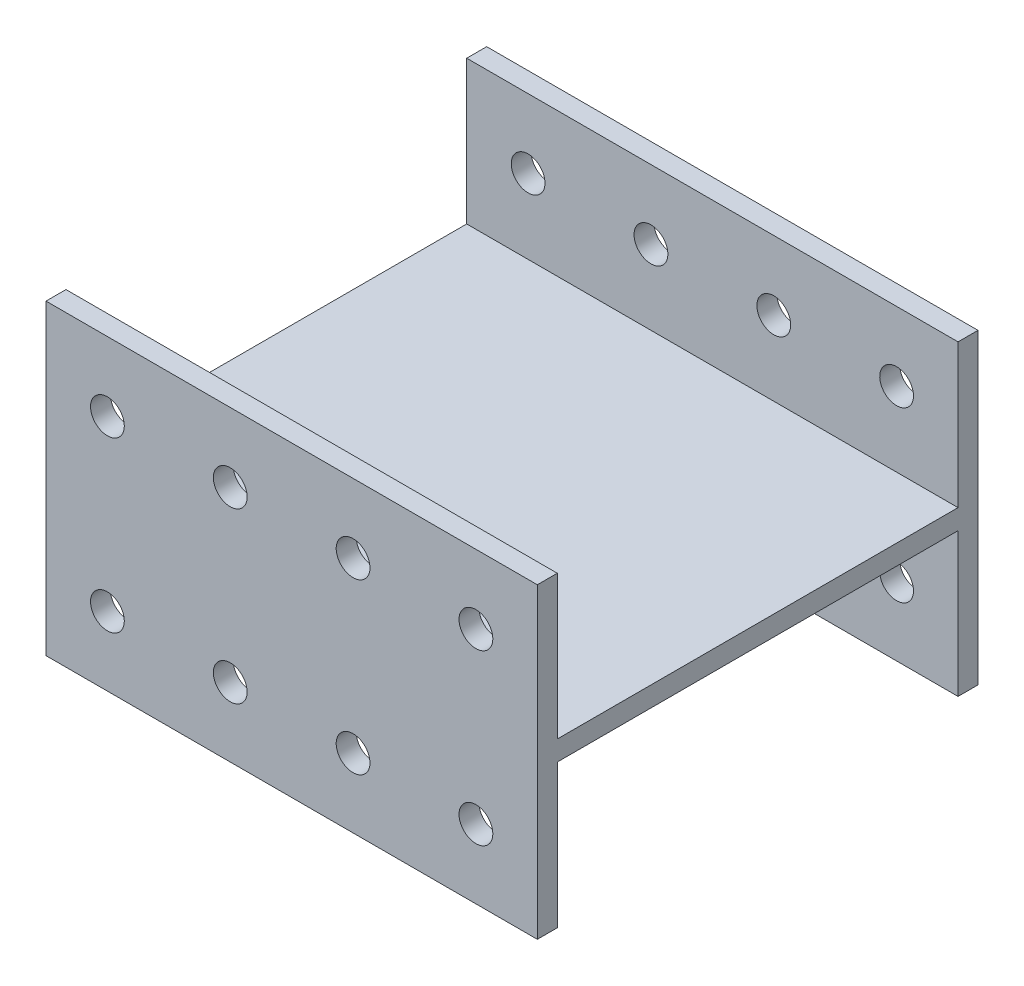
ISO-10303-21;
HEADER;
FILE_DESCRIPTION(('STEP AP214'),'2;1');
FILE_NAME('part.step','',(''),(''),'','','');
FILE_SCHEMA(('AUTOMOTIVE_DESIGN { 1 0 10303 214 1 1 1 1 }'));
ENDSEC;
DATA;
#1=APPLICATION_CONTEXT('core data for automotive mechanical design processes');
#2=APPLICATION_PROTOCOL_DEFINITION('international standard','automotive_design',2000,#1);
#3=PRODUCT_CONTEXT('',#1,'mechanical');
#4=PRODUCT('Part','Part','',(#3));
#5=PRODUCT_RELATED_PRODUCT_CATEGORY('part','',(#4));
#6=PRODUCT_DEFINITION_FORMATION('','',#4);
#7=PRODUCT_DEFINITION_CONTEXT('part definition',#1,'design');
#8=PRODUCT_DEFINITION('design','',#6,#7);
#9=PRODUCT_DEFINITION_SHAPE('','',#8);
#10=(LENGTH_UNIT() NAMED_UNIT(*) SI_UNIT(.MILLI.,.METRE.));
#11=(NAMED_UNIT(*) PLANE_ANGLE_UNIT() SI_UNIT($,.RADIAN.));
#12=(NAMED_UNIT(*) SI_UNIT($,.STERADIAN.) SOLID_ANGLE_UNIT());
#13=UNCERTAINTY_MEASURE_WITH_UNIT(LENGTH_MEASURE(1.E-05),#10,'distance_accuracy_value','');
#14=(GEOMETRIC_REPRESENTATION_CONTEXT(3) GLOBAL_UNCERTAINTY_ASSIGNED_CONTEXT((#13)) GLOBAL_UNIT_ASSIGNED_CONTEXT((#10,
#11,#12)) REPRESENTATION_CONTEXT('',''));
#15=CARTESIAN_POINT('',(0.,0.,0.));
#16=DIRECTION('',(0.,0.,1.));
#17=DIRECTION('',(1.,0.,0.));
#18=AXIS2_PLACEMENT_3D('',#15,#16,#17);
#19=CARTESIAN_POINT('',(0.,0.,287.));
#20=DIRECTION('',(0.,1.,0.));
#21=DIRECTION('',(0.,0.,1.));
#22=AXIS2_PLACEMENT_3D('',#19,#20,#21);
#23=PLANE('',#22);
#24=DIRECTION('',(0.,0.,-1.));
#25=VECTOR('',#24,1.);
#26=CARTESIAN_POINT('',(320.,0.,287.));
#27=LINE('',#26,#25);
#28=CARTESIAN_POINT('',(320.,0.,13.));
#29=VERTEX_POINT('',#28);
#30=CARTESIAN_POINT('',(320.,0.,0.));
#31=VERTEX_POINT('',#30);
#32=EDGE_CURVE('E140',#29,#31,#27,.T.);
#33=ORIENTED_EDGE('',*,*,#32,.F.);
#34=DIRECTION('',(-1.,0.,0.));
#35=VECTOR('',#34,1.);
#36=CARTESIAN_POINT('',(320.,0.,13.));
#37=LINE('',#36,#35);
#38=CARTESIAN_POINT('',(0.,0.,13.));
#39=VERTEX_POINT('',#38);
#40=EDGE_CURVE('E125',#29,#39,#37,.T.);
#41=ORIENTED_EDGE('',*,*,#40,.T.);
#42=DIRECTION('',(0.,0.,-1.));
#43=VECTOR('',#42,1.);
#44=CARTESIAN_POINT('',(0.,0.,287.));
#45=LINE('',#44,#43);
#46=CARTESIAN_POINT('',(0.,0.,0.));
#47=VERTEX_POINT('',#46);
#48=EDGE_CURVE('E153',#39,#47,#45,.T.);
#49=ORIENTED_EDGE('',*,*,#48,.T.);
#50=DIRECTION('',(1.,0.,0.));
#51=VECTOR('',#50,1.);
#52=CARTESIAN_POINT('',(0.,0.,0.));
#53=LINE('',#52,#51);
#54=EDGE_CURVE('E147',#47,#31,#53,.T.);
#55=ORIENTED_EDGE('',*,*,#54,.T.);
#56=EDGE_LOOP('',(#33,#41,#49,#55));
#57=FACE_BOUND('',#56,.T.);
#58=ADVANCED_FACE('F34',(#57),#23,.F.);
#59=CARTESIAN_POINT('',(40.,45.,0.));
#60=DIRECTION('',(0.,0.,1.));
#61=DIRECTION('',(1.,0.,0.));
#62=AXIS2_PLACEMENT_3D('',#59,#60,#61);
#63=CYLINDRICAL_SURFACE('',#62,11.);
#64=CARTESIAN_POINT('',(40.,45.,13.));
#65=DIRECTION('',(0.,0.,-1.));
#66=DIRECTION('',(0.,1.,0.));
#67=AXIS2_PLACEMENT_3D('',#64,#65,#66);
#68=CIRCLE('',#67,11.);
#69=CARTESIAN_POINT('',(40.,56.,13.));
#70=VERTEX_POINT('',#69);
#71=EDGE_CURVE('E231',#70,#70,#68,.F.);
#72=ORIENTED_EDGE('',*,*,#71,.T.);
#73=EDGE_LOOP('',(#72));
#74=FACE_BOUND('',#73,.T.);
#75=CARTESIAN_POINT('',(40.,45.,0.));
#76=DIRECTION('',(0.,0.,1.));
#77=DIRECTION('',(1.,0.,0.));
#78=AXIS2_PLACEMENT_3D('',#75,#76,#77);
#79=CIRCLE('',#78,11.);
#80=CARTESIAN_POINT('',(51.,45.,0.));
#81=VERTEX_POINT('',#80);
#82=EDGE_CURVE('E279',#81,#81,#79,.T.);
#83=ORIENTED_EDGE('',*,*,#82,.F.);
#84=EDGE_LOOP('',(#83));
#85=FACE_BOUND('',#84,.T.);
#86=ADVANCED_FACE('F361',(#74,#85),#63,.F.);
#87=CARTESIAN_POINT('',(120.,45.,0.));
#88=DIRECTION('',(0.,0.,1.));
#89=DIRECTION('',(1.,0.,0.));
#90=AXIS2_PLACEMENT_3D('',#87,#88,#89);
#91=CYLINDRICAL_SURFACE('',#90,11.);
#92=CARTESIAN_POINT('',(120.,45.,13.));
#93=DIRECTION('',(0.,0.,-1.));
#94=DIRECTION('',(0.,1.,0.));
#95=AXIS2_PLACEMENT_3D('',#92,#93,#94);
#96=CIRCLE('',#95,11.);
#97=CARTESIAN_POINT('',(120.,56.,13.));
#98=VERTEX_POINT('',#97);
#99=EDGE_CURVE('E228',#98,#98,#96,.F.);
#100=ORIENTED_EDGE('',*,*,#99,.T.);
#101=EDGE_LOOP('',(#100));
#102=FACE_BOUND('',#101,.T.);
#103=CARTESIAN_POINT('',(120.,45.,0.));
#104=DIRECTION('',(0.,0.,1.));
#105=DIRECTION('',(1.,0.,0.));
#106=AXIS2_PLACEMENT_3D('',#103,#104,#105);
#107=CIRCLE('',#106,11.);
#108=CARTESIAN_POINT('',(131.,45.,0.));
#109=VERTEX_POINT('',#108);
#110=EDGE_CURVE('E272',#109,#109,#107,.T.);
#111=ORIENTED_EDGE('',*,*,#110,.F.);
#112=EDGE_LOOP('',(#111));
#113=FACE_BOUND('',#112,.T.);
#114=ADVANCED_FACE('F366',(#102,#113),#91,.F.);
#115=CARTESIAN_POINT('',(200.,45.,0.));
#116=DIRECTION('',(0.,0.,1.));
#117=DIRECTION('',(1.,0.,0.));
#118=AXIS2_PLACEMENT_3D('',#115,#116,#117);
#119=CYLINDRICAL_SURFACE('',#118,11.);
#120=CARTESIAN_POINT('',(200.,45.,13.));
#121=DIRECTION('',(0.,0.,-1.));
#122=DIRECTION('',(0.,1.,0.));
#123=AXIS2_PLACEMENT_3D('',#120,#121,#122);
#124=CIRCLE('',#123,11.);
#125=CARTESIAN_POINT('',(200.,56.,13.));
#126=VERTEX_POINT('',#125);
#127=EDGE_CURVE('E225',#126,#126,#124,.F.);
#128=ORIENTED_EDGE('',*,*,#127,.T.);
#129=EDGE_LOOP('',(#128));
#130=FACE_BOUND('',#129,.T.);
#131=CARTESIAN_POINT('',(200.,45.,0.));
#132=DIRECTION('',(0.,0.,1.));
#133=DIRECTION('',(1.,0.,0.));
#134=AXIS2_PLACEMENT_3D('',#131,#132,#133);
#135=CIRCLE('',#134,11.);
#136=CARTESIAN_POINT('',(211.,45.,0.));
#137=VERTEX_POINT('',#136);
#138=EDGE_CURVE('E162',#137,#137,#135,.T.);
#139=ORIENTED_EDGE('',*,*,#138,.F.);
#140=EDGE_LOOP('',(#139));
#141=FACE_BOUND('',#140,.T.);
#142=ADVANCED_FACE('F390',(#130,#141),#119,.F.);
#143=CARTESIAN_POINT('',(280.,45.,0.));
#144=DIRECTION('',(0.,0.,1.));
#145=DIRECTION('',(1.,0.,0.));
#146=AXIS2_PLACEMENT_3D('',#143,#144,#145);
#147=CYLINDRICAL_SURFACE('',#146,11.);
#148=CARTESIAN_POINT('',(280.,45.,13.));
#149=DIRECTION('',(0.,0.,-1.));
#150=DIRECTION('',(0.,1.,0.));
#151=AXIS2_PLACEMENT_3D('',#148,#149,#150);
#152=CIRCLE('',#151,11.);
#153=CARTESIAN_POINT('',(280.,56.,13.));
#154=VERTEX_POINT('',#153);
#155=EDGE_CURVE('E38',#154,#154,#152,.F.);
#156=ORIENTED_EDGE('',*,*,#155,.T.);
#157=EDGE_LOOP('',(#156));
#158=FACE_BOUND('',#157,.T.);
#159=CARTESIAN_POINT('',(280.,45.,0.));
#160=DIRECTION('',(0.,0.,1.));
#161=DIRECTION('',(1.,0.,0.));
#162=AXIS2_PLACEMENT_3D('',#159,#160,#161);
#163=CIRCLE('',#162,11.);
#164=CARTESIAN_POINT('',(291.,45.,0.));
#165=VERTEX_POINT('',#164);
#166=EDGE_CURVE('E168',#165,#165,#163,.T.);
#167=ORIENTED_EDGE('',*,*,#166,.F.);
#168=EDGE_LOOP('',(#167));
#169=FACE_BOUND('',#168,.T.);
#170=ADVANCED_FACE('F394',(#158,#169),#147,.F.);
#171=CARTESIAN_POINT('',(0.,200.,287.));
#172=DIRECTION('',(0.,-1.,0.));
#173=DIRECTION('',(0.,0.,-1.));
#174=AXIS2_PLACEMENT_3D('',#171,#172,#173);
#175=PLANE('',#174);
#176=DIRECTION('',(0.,0.,-1.));
#177=VECTOR('',#176,1.);
#178=CARTESIAN_POINT('',(0.,200.,287.));
#179=LINE('',#178,#177);
#180=CARTESIAN_POINT('',(0.,200.,13.));
#181=VERTEX_POINT('',#180);
#182=CARTESIAN_POINT('',(0.,200.,0.));
#183=VERTEX_POINT('',#182);
#184=EDGE_CURVE('E295',#181,#183,#179,.T.);
#185=ORIENTED_EDGE('',*,*,#184,.F.);
#186=DIRECTION('',(-1.,0.,0.));
#187=VECTOR('',#186,1.);
#188=CARTESIAN_POINT('',(320.,200.,13.));
#189=LINE('',#188,#187);
#190=CARTESIAN_POINT('',(320.,200.,13.));
#191=VERTEX_POINT('',#190);
#192=EDGE_CURVE('E198',#191,#181,#189,.T.);
#193=ORIENTED_EDGE('',*,*,#192,.F.);
#194=DIRECTION('',(0.,0.,-1.));
#195=VECTOR('',#194,1.);
#196=CARTESIAN_POINT('',(320.,200.,287.));
#197=LINE('',#196,#195);
#198=CARTESIAN_POINT('',(320.,200.,0.));
#199=VERTEX_POINT('',#198);
#200=EDGE_CURVE('E155',#191,#199,#197,.T.);
#201=ORIENTED_EDGE('',*,*,#200,.T.);
#202=DIRECTION('',(-1.,0.,0.));
#203=VECTOR('',#202,1.);
#204=CARTESIAN_POINT('',(0.,200.,0.));
#205=LINE('',#204,#203);
#206=EDGE_CURVE('E289',#199,#183,#205,.T.);
#207=ORIENTED_EDGE('',*,*,#206,.T.);
#208=EDGE_LOOP('',(#185,#193,#201,#207));
#209=FACE_BOUND('',#208,.T.);
#210=ADVANCED_FACE('F315',(#209),#175,.F.);
#211=CARTESIAN_POINT('',(40.,155.,0.));
#212=DIRECTION('',(0.,0.,1.));
#213=DIRECTION('',(1.,0.,0.));
#214=AXIS2_PLACEMENT_3D('',#211,#212,#213);
#215=CYLINDRICAL_SURFACE('',#214,11.);
#216=CARTESIAN_POINT('',(40.,155.,13.));
#217=DIRECTION('',(0.,0.,-1.));
#218=DIRECTION('',(0.,1.,0.));
#219=AXIS2_PLACEMENT_3D('',#216,#217,#218);
#220=CIRCLE('',#219,11.);
#221=CARTESIAN_POINT('',(40.,166.,13.));
#222=VERTEX_POINT('',#221);
#223=EDGE_CURVE('E269',#222,#222,#220,.F.);
#224=ORIENTED_EDGE('',*,*,#223,.T.);
#225=EDGE_LOOP('',(#224));
#226=FACE_BOUND('',#225,.T.);
#227=CARTESIAN_POINT('',(40.,155.,0.));
#228=DIRECTION('',(0.,0.,1.));
#229=DIRECTION('',(1.,0.,0.));
#230=AXIS2_PLACEMENT_3D('',#227,#228,#229);
#231=CIRCLE('',#230,11.);
#232=CARTESIAN_POINT('',(51.,155.,0.));
#233=VERTEX_POINT('',#232);
#234=EDGE_CURVE('E174',#233,#233,#231,.T.);
#235=ORIENTED_EDGE('',*,*,#234,.F.);
#236=EDGE_LOOP('',(#235));
#237=FACE_BOUND('',#236,.T.);
#238=ADVANCED_FACE('F399',(#226,#237),#215,.F.);
#239=CARTESIAN_POINT('',(120.,155.,0.));
#240=DIRECTION('',(0.,0.,1.));
#241=DIRECTION('',(1.,0.,0.));
#242=AXIS2_PLACEMENT_3D('',#239,#240,#241);
#243=CYLINDRICAL_SURFACE('',#242,11.);
#244=CARTESIAN_POINT('',(120.,155.,13.));
#245=DIRECTION('',(0.,0.,-1.));
#246=DIRECTION('',(0.,1.,0.));
#247=AXIS2_PLACEMENT_3D('',#244,#245,#246);
#248=CIRCLE('',#247,11.);
#249=CARTESIAN_POINT('',(120.,166.,13.));
#250=VERTEX_POINT('',#249);
#251=EDGE_CURVE('E266',#250,#250,#248,.F.);
#252=ORIENTED_EDGE('',*,*,#251,.T.);
#253=EDGE_LOOP('',(#252));
#254=FACE_BOUND('',#253,.T.);
#255=CARTESIAN_POINT('',(120.,155.,0.));
#256=DIRECTION('',(0.,0.,1.));
#257=DIRECTION('',(1.,0.,0.));
#258=AXIS2_PLACEMENT_3D('',#255,#256,#257);
#259=CIRCLE('',#258,11.);
#260=CARTESIAN_POINT('',(131.,155.,0.));
#261=VERTEX_POINT('',#260);
#262=EDGE_CURVE('E180',#261,#261,#259,.T.);
#263=ORIENTED_EDGE('',*,*,#262,.F.);
#264=EDGE_LOOP('',(#263));
#265=FACE_BOUND('',#264,.T.);
#266=ADVANCED_FACE('F403',(#254,#265),#243,.F.);
#267=CARTESIAN_POINT('',(200.,155.,0.));
#268=DIRECTION('',(0.,0.,1.));
#269=DIRECTION('',(1.,0.,0.));
#270=AXIS2_PLACEMENT_3D('',#267,#268,#269);
#271=CYLINDRICAL_SURFACE('',#270,11.);
#272=CARTESIAN_POINT('',(200.,155.,13.));
#273=DIRECTION('',(0.,0.,-1.));
#274=DIRECTION('',(0.,1.,0.));
#275=AXIS2_PLACEMENT_3D('',#272,#273,#274);
#276=CIRCLE('',#275,11.);
#277=CARTESIAN_POINT('',(200.,166.,13.));
#278=VERTEX_POINT('',#277);
#279=EDGE_CURVE('E201',#278,#278,#276,.F.);
#280=ORIENTED_EDGE('',*,*,#279,.T.);
#281=EDGE_LOOP('',(#280));
#282=FACE_BOUND('',#281,.T.);
#283=CARTESIAN_POINT('',(200.,155.,0.));
#284=DIRECTION('',(0.,0.,1.));
#285=DIRECTION('',(1.,0.,0.));
#286=AXIS2_PLACEMENT_3D('',#283,#284,#285);
#287=CIRCLE('',#286,11.);
#288=CARTESIAN_POINT('',(211.,155.,0.));
#289=VERTEX_POINT('',#288);
#290=EDGE_CURVE('E186',#289,#289,#287,.T.);
#291=ORIENTED_EDGE('',*,*,#290,.F.);
#292=EDGE_LOOP('',(#291));
#293=FACE_BOUND('',#292,.T.);
#294=ADVANCED_FACE('F381',(#282,#293),#271,.F.);
#295=CARTESIAN_POINT('',(280.,155.,0.));
#296=DIRECTION('',(0.,0.,1.));
#297=DIRECTION('',(1.,0.,0.));
#298=AXIS2_PLACEMENT_3D('',#295,#296,#297);
#299=CYLINDRICAL_SURFACE('',#298,11.);
#300=CARTESIAN_POINT('',(280.,155.,13.));
#301=DIRECTION('',(0.,0.,-1.));
#302=DIRECTION('',(0.,1.,0.));
#303=AXIS2_PLACEMENT_3D('',#300,#301,#302);
#304=CIRCLE('',#303,11.);
#305=CARTESIAN_POINT('',(280.,166.,13.));
#306=VERTEX_POINT('',#305);
#307=EDGE_CURVE('E199',#306,#306,#304,.F.);
#308=ORIENTED_EDGE('',*,*,#307,.T.);
#309=EDGE_LOOP('',(#308));
#310=FACE_BOUND('',#309,.T.);
#311=CARTESIAN_POINT('',(280.,155.,0.));
#312=DIRECTION('',(0.,0.,1.));
#313=DIRECTION('',(1.,0.,0.));
#314=AXIS2_PLACEMENT_3D('',#311,#312,#313);
#315=CIRCLE('',#314,11.);
#316=CARTESIAN_POINT('',(291.,155.,0.));
#317=VERTEX_POINT('',#316);
#318=EDGE_CURVE('E43',#317,#317,#315,.T.);
#319=ORIENTED_EDGE('',*,*,#318,.F.);
#320=EDGE_LOOP('',(#319));
#321=FACE_BOUND('',#320,.T.);
#322=ADVANCED_FACE('F377',(#310,#321),#299,.F.);
#323=CARTESIAN_POINT('',(0.,200.,287.));
#324=DIRECTION('',(1.,0.,0.));
#325=DIRECTION('',(0.,0.,-1.));
#326=AXIS2_PLACEMENT_3D('',#323,#324,#325);
#327=PLANE('',#326);
#328=ORIENTED_EDGE('',*,*,#48,.F.);
#329=DIRECTION('',(0.,-1.,0.));
#330=VECTOR('',#329,1.);
#331=CARTESIAN_POINT('',(0.,0.,13.));
#332=LINE('',#331,#330);
#333=CARTESIAN_POINT('',(0.,93.5,13.));
#334=VERTEX_POINT('',#333);
#335=EDGE_CURVE('E131',#334,#39,#332,.T.);
#336=ORIENTED_EDGE('',*,*,#335,.F.);
#337=DIRECTION('',(0.,0.,-1.));
#338=VECTOR('',#337,1.);
#339=CARTESIAN_POINT('',(0.,93.5,13.));
#340=LINE('',#339,#338);
#341=CARTESIAN_POINT('',(0.,93.5,274.));
#342=VERTEX_POINT('',#341);
#343=EDGE_CURVE('E144',#342,#334,#340,.T.);
#344=ORIENTED_EDGE('',*,*,#343,.F.);
#345=DIRECTION('',(0.,1.,0.));
#346=VECTOR('',#345,1.);
#347=CARTESIAN_POINT('',(0.,0.,274.));
#348=LINE('',#347,#346);
#349=CARTESIAN_POINT('',(0.,0.,274.));
#350=VERTEX_POINT('',#349);
#351=EDGE_CURVE('E347',#350,#342,#348,.T.);
#352=ORIENTED_EDGE('',*,*,#351,.F.);
#353=CARTESIAN_POINT('',(0.,0.,287.));
#354=VERTEX_POINT('',#353);
#355=EDGE_CURVE('E159',#354,#350,#45,.T.);
#356=ORIENTED_EDGE('',*,*,#355,.F.);
#357=DIRECTION('',(0.,-1.,0.));
#358=VECTOR('',#357,1.);
#359=CARTESIAN_POINT('',(0.,200.,287.));
#360=LINE('',#359,#358);
#361=CARTESIAN_POINT('',(0.,200.,287.));
#362=VERTEX_POINT('',#361);
#363=EDGE_CURVE('E285',#362,#354,#360,.T.);
#364=ORIENTED_EDGE('',*,*,#363,.F.);
#365=CARTESIAN_POINT('',(0.,200.,274.));
#366=VERTEX_POINT('',#365);
#367=EDGE_CURVE('E302',#362,#366,#179,.T.);
#368=ORIENTED_EDGE('',*,*,#367,.T.);
#369=DIRECTION('',(0.,1.,0.));
#370=VECTOR('',#369,1.);
#371=CARTESIAN_POINT('',(0.,200.,274.));
#372=LINE('',#371,#370);
#373=CARTESIAN_POINT('',(0.,106.5,274.));
#374=VERTEX_POINT('',#373);
#375=EDGE_CURVE('E59',#374,#366,#372,.T.);
#376=ORIENTED_EDGE('',*,*,#375,.F.);
#377=DIRECTION('',(0.,0.,1.));
#378=VECTOR('',#377,1.);
#379=CARTESIAN_POINT('',(0.,106.5,13.));
#380=LINE('',#379,#378);
#381=CARTESIAN_POINT('',(0.,106.5,13.));
#382=VERTEX_POINT('',#381);
#383=EDGE_CURVE('E247',#382,#374,#380,.T.);
#384=ORIENTED_EDGE('',*,*,#383,.F.);
#385=DIRECTION('',(0.,-1.,0.));
#386=VECTOR('',#385,1.);
#387=CARTESIAN_POINT('',(0.,200.,13.));
#388=LINE('',#387,#386);
#389=EDGE_CURVE('E234',#181,#382,#388,.T.);
#390=ORIENTED_EDGE('',*,*,#389,.F.);
#391=ORIENTED_EDGE('',*,*,#184,.T.);
#392=DIRECTION('',(0.,-1.,0.));
#393=VECTOR('',#392,1.);
#394=CARTESIAN_POINT('',(0.,200.,0.));
#395=LINE('',#394,#393);
#396=EDGE_CURVE('E282',#183,#47,#395,.T.);
#397=ORIENTED_EDGE('',*,*,#396,.T.);
#398=EDGE_LOOP('',(#328,#336,#344,#352,#356,#364,#368,#376,#384,#390,#391,#397));
#399=FACE_BOUND('',#398,.T.);
#400=ADVANCED_FACE('F309',(#399),#327,.F.);
#401=ORIENTED_EDGE('',*,*,#355,.T.);
#402=DIRECTION('',(-1.,0.,0.));
#403=VECTOR('',#402,1.);
#404=CARTESIAN_POINT('',(320.,0.,274.));
#405=LINE('',#404,#403);
#406=CARTESIAN_POINT('',(320.,0.,274.));
#407=VERTEX_POINT('',#406);
#408=EDGE_CURVE('E135',#407,#350,#405,.T.);
#409=ORIENTED_EDGE('',*,*,#408,.F.);
#410=CARTESIAN_POINT('',(320.,0.,287.));
#411=VERTEX_POINT('',#410);
#412=EDGE_CURVE('E149',#411,#407,#27,.T.);
#413=ORIENTED_EDGE('',*,*,#412,.F.);
#414=DIRECTION('',(1.,0.,0.));
#415=VECTOR('',#414,1.);
#416=CARTESIAN_POINT('',(0.,0.,287.));
#417=LINE('',#416,#415);
#418=EDGE_CURVE('E288',#354,#411,#417,.T.);
#419=ORIENTED_EDGE('',*,*,#418,.F.);
#420=EDGE_LOOP('',(#401,#409,#413,#419));
#421=FACE_BOUND('',#420,.T.);
#422=ADVANCED_FACE('F341',(#421),#23,.F.);
#423=CARTESIAN_POINT('',(320.,200.,287.));
#424=DIRECTION('',(-1.,0.,0.));
#425=DIRECTION('',(0.,-1.,0.));
#426=AXIS2_PLACEMENT_3D('',#423,#424,#425);
#427=PLANE('',#426);
#428=DIRECTION('',(0.,0.,-1.));
#429=VECTOR('',#428,1.);
#430=CARTESIAN_POINT('',(320.,93.5,13.));
#431=LINE('',#430,#429);
#432=CARTESIAN_POINT('',(320.,93.5,274.));
#433=VERTEX_POINT('',#432);
#434=CARTESIAN_POINT('',(320.,93.5,13.));
#435=VERTEX_POINT('',#434);
#436=EDGE_CURVE('E51',#433,#435,#431,.T.);
#437=ORIENTED_EDGE('',*,*,#436,.T.);
#438=DIRECTION('',(0.,-1.,0.));
#439=VECTOR('',#438,1.);
#440=CARTESIAN_POINT('',(320.,0.,13.));
#441=LINE('',#440,#439);
#442=EDGE_CURVE('E129',#435,#29,#441,.T.);
#443=ORIENTED_EDGE('',*,*,#442,.T.);
#444=ORIENTED_EDGE('',*,*,#32,.T.);
#445=DIRECTION('',(0.,1.,0.));
#446=VECTOR('',#445,1.);
#447=CARTESIAN_POINT('',(320.,200.,0.));
#448=LINE('',#447,#446);
#449=EDGE_CURVE('E299',#31,#199,#448,.T.);
#450=ORIENTED_EDGE('',*,*,#449,.T.);
#451=ORIENTED_EDGE('',*,*,#200,.F.);
#452=DIRECTION('',(0.,-1.,0.));
#453=VECTOR('',#452,1.);
#454=CARTESIAN_POINT('',(320.,200.,13.));
#455=LINE('',#454,#453);
#456=CARTESIAN_POINT('',(320.,106.5,13.));
#457=VERTEX_POINT('',#456);
#458=EDGE_CURVE('E235',#191,#457,#455,.T.);
#459=ORIENTED_EDGE('',*,*,#458,.T.);
#460=DIRECTION('',(0.,0.,1.));
#461=VECTOR('',#460,1.);
#462=CARTESIAN_POINT('',(320.,106.5,13.));
#463=LINE('',#462,#461);
#464=CARTESIAN_POINT('',(320.,106.5,274.));
#465=VERTEX_POINT('',#464);
#466=EDGE_CURVE('E238',#457,#465,#463,.T.);
#467=ORIENTED_EDGE('',*,*,#466,.T.);
#468=DIRECTION('',(0.,1.,0.));
#469=VECTOR('',#468,1.);
#470=CARTESIAN_POINT('',(320.,200.,274.));
#471=LINE('',#470,#469);
#472=CARTESIAN_POINT('',(320.,200.,274.));
#473=VERTEX_POINT('',#472);
#474=EDGE_CURVE('E241',#465,#473,#471,.T.);
#475=ORIENTED_EDGE('',*,*,#474,.T.);
#476=CARTESIAN_POINT('',(320.,200.,287.));
#477=VERTEX_POINT('',#476);
#478=EDGE_CURVE('E150',#477,#473,#197,.T.);
#479=ORIENTED_EDGE('',*,*,#478,.F.);
#480=DIRECTION('',(0.,1.,0.));
#481=VECTOR('',#480,1.);
#482=CARTESIAN_POINT('',(320.,200.,287.));
#483=LINE('',#482,#481);
#484=EDGE_CURVE('E291',#411,#477,#483,.T.);
#485=ORIENTED_EDGE('',*,*,#484,.F.);
#486=ORIENTED_EDGE('',*,*,#412,.T.);
#487=DIRECTION('',(0.,1.,0.));
#488=VECTOR('',#487,1.);
#489=CARTESIAN_POINT('',(320.,0.,274.));
#490=LINE('',#489,#488);
#491=EDGE_CURVE('E143',#407,#433,#490,.T.);
#492=ORIENTED_EDGE('',*,*,#491,.T.);
#493=EDGE_LOOP('',(#437,#443,#444,#450,#451,#459,#467,#475,#479,#485,#486,#492));
#494=FACE_BOUND('',#493,.T.);
#495=ADVANCED_FACE('F138',(#494),#427,.F.);
#496=ORIENTED_EDGE('',*,*,#478,.T.);
#497=DIRECTION('',(-1.,0.,0.));
#498=VECTOR('',#497,1.);
#499=CARTESIAN_POINT('',(320.,200.,274.));
#500=LINE('',#499,#498);
#501=EDGE_CURVE('E252',#473,#366,#500,.T.);
#502=ORIENTED_EDGE('',*,*,#501,.T.);
#503=ORIENTED_EDGE('',*,*,#367,.F.);
#504=DIRECTION('',(-1.,0.,0.));
#505=VECTOR('',#504,1.);
#506=CARTESIAN_POINT('',(0.,200.,287.));
#507=LINE('',#506,#505);
#508=EDGE_CURVE('E293',#477,#362,#507,.T.);
#509=ORIENTED_EDGE('',*,*,#508,.F.);
#510=EDGE_LOOP('',(#496,#502,#503,#509));
#511=FACE_BOUND('',#510,.T.);
#512=ADVANCED_FACE('F333',(#511),#175,.F.);
#513=CARTESIAN_POINT('',(0.,0.,287.));
#514=DIRECTION('',(0.,0.,1.));
#515=DIRECTION('',(1.,0.,0.));
#516=AXIS2_PLACEMENT_3D('',#513,#514,#515);
#517=PLANE('',#516);
#518=CARTESIAN_POINT('',(120.,45.,287.));
#519=DIRECTION('',(0.,0.,1.));
#520=DIRECTION('',(1.,0.,0.));
#521=AXIS2_PLACEMENT_3D('',#518,#519,#520);
#522=CIRCLE('',#521,11.);
#523=CARTESIAN_POINT('',(131.,45.,287.));
#524=VERTEX_POINT('',#523);
#525=EDGE_CURVE('E275',#524,#524,#522,.T.);
#526=ORIENTED_EDGE('',*,*,#525,.F.);
#527=EDGE_LOOP('',(#526));
#528=FACE_BOUND('',#527,.T.);
#529=CARTESIAN_POINT('',(40.,45.,287.));
#530=DIRECTION('',(0.,0.,1.));
#531=DIRECTION('',(1.,0.,0.));
#532=AXIS2_PLACEMENT_3D('',#529,#530,#531);
#533=CIRCLE('',#532,11.);
#534=CARTESIAN_POINT('',(51.,45.,287.));
#535=VERTEX_POINT('',#534);
#536=EDGE_CURVE('E278',#535,#535,#533,.T.);
#537=ORIENTED_EDGE('',*,*,#536,.F.);
#538=EDGE_LOOP('',(#537));
#539=FACE_BOUND('',#538,.T.);
#540=ORIENTED_EDGE('',*,*,#363,.T.);
#541=ORIENTED_EDGE('',*,*,#418,.T.);
#542=ORIENTED_EDGE('',*,*,#484,.T.);
#543=ORIENTED_EDGE('',*,*,#508,.T.);
#544=EDGE_LOOP('',(#540,#541,#542,#543));
#545=FACE_BOUND('',#544,.T.);
#546=CARTESIAN_POINT('',(200.,45.,287.));
#547=DIRECTION('',(0.,0.,1.));
#548=DIRECTION('',(1.,0.,0.));
#549=AXIS2_PLACEMENT_3D('',#546,#547,#548);
#550=CIRCLE('',#549,11.);
#551=CARTESIAN_POINT('',(211.,45.,287.));
#552=VERTEX_POINT('',#551);
#553=EDGE_CURVE('E165',#552,#552,#550,.T.);
#554=ORIENTED_EDGE('',*,*,#553,.F.);
#555=EDGE_LOOP('',(#554));
#556=FACE_BOUND('',#555,.T.);
#557=CARTESIAN_POINT('',(280.,45.,287.));
#558=DIRECTION('',(0.,0.,1.));
#559=DIRECTION('',(1.,0.,0.));
#560=AXIS2_PLACEMENT_3D('',#557,#558,#559);
#561=CIRCLE('',#560,11.);
#562=CARTESIAN_POINT('',(291.,45.,287.));
#563=VERTEX_POINT('',#562);
#564=EDGE_CURVE('E171',#563,#563,#561,.T.);
#565=ORIENTED_EDGE('',*,*,#564,.F.);
#566=EDGE_LOOP('',(#565));
#567=FACE_BOUND('',#566,.T.);
#568=CARTESIAN_POINT('',(40.,155.,287.));
#569=DIRECTION('',(0.,0.,1.));
#570=DIRECTION('',(1.,0.,0.));
#571=AXIS2_PLACEMENT_3D('',#568,#569,#570);
#572=CIRCLE('',#571,11.);
#573=CARTESIAN_POINT('',(51.,155.,287.));
#574=VERTEX_POINT('',#573);
#575=EDGE_CURVE('E177',#574,#574,#572,.T.);
#576=ORIENTED_EDGE('',*,*,#575,.F.);
#577=EDGE_LOOP('',(#576));
#578=FACE_BOUND('',#577,.T.);
#579=CARTESIAN_POINT('',(120.,155.,287.));
#580=DIRECTION('',(0.,0.,1.));
#581=DIRECTION('',(1.,0.,0.));
#582=AXIS2_PLACEMENT_3D('',#579,#580,#581);
#583=CIRCLE('',#582,11.);
#584=CARTESIAN_POINT('',(131.,155.,287.));
#585=VERTEX_POINT('',#584);
#586=EDGE_CURVE('E183',#585,#585,#583,.T.);
#587=ORIENTED_EDGE('',*,*,#586,.F.);
#588=EDGE_LOOP('',(#587));
#589=FACE_BOUND('',#588,.T.);
#590=CARTESIAN_POINT('',(200.,155.,287.));
#591=DIRECTION('',(0.,0.,1.));
#592=DIRECTION('',(1.,0.,0.));
#593=AXIS2_PLACEMENT_3D('',#590,#591,#592);
#594=CIRCLE('',#593,11.);
#595=CARTESIAN_POINT('',(211.,155.,287.));
#596=VERTEX_POINT('',#595);
#597=EDGE_CURVE('E189',#596,#596,#594,.T.);
#598=ORIENTED_EDGE('',*,*,#597,.F.);
#599=EDGE_LOOP('',(#598));
#600=FACE_BOUND('',#599,.T.);
#601=CARTESIAN_POINT('',(280.,155.,287.));
#602=DIRECTION('',(0.,0.,1.));
#603=DIRECTION('',(1.,0.,0.));
#604=AXIS2_PLACEMENT_3D('',#601,#602,#603);
#605=CIRCLE('',#604,11.);
#606=CARTESIAN_POINT('',(291.,155.,287.));
#607=VERTEX_POINT('',#606);
#608=EDGE_CURVE('E11',#607,#607,#605,.T.);
#609=ORIENTED_EDGE('',*,*,#608,.F.);
#610=EDGE_LOOP('',(#609));
#611=FACE_BOUND('',#610,.T.);
#612=ADVANCED_FACE('F335',(#528,#539,#545,#556,#567,#578,#589,#600,#611),#517,.T.);
#613=CARTESIAN_POINT('',(0.,0.,0.));
#614=DIRECTION('',(0.,0.,1.));
#615=DIRECTION('',(1.,0.,0.));
#616=AXIS2_PLACEMENT_3D('',#613,#614,#615);
#617=PLANE('',#616);
#618=ORIENTED_EDGE('',*,*,#110,.T.);
#619=EDGE_LOOP('',(#618));
#620=FACE_BOUND('',#619,.T.);
#621=ORIENTED_EDGE('',*,*,#82,.T.);
#622=EDGE_LOOP('',(#621));
#623=FACE_BOUND('',#622,.T.);
#624=ORIENTED_EDGE('',*,*,#396,.F.);
#625=ORIENTED_EDGE('',*,*,#206,.F.);
#626=ORIENTED_EDGE('',*,*,#449,.F.);
#627=ORIENTED_EDGE('',*,*,#54,.F.);
#628=EDGE_LOOP('',(#624,#625,#626,#627));
#629=FACE_BOUND('',#628,.T.);
#630=ORIENTED_EDGE('',*,*,#138,.T.);
#631=EDGE_LOOP('',(#630));
#632=FACE_BOUND('',#631,.T.);
#633=ORIENTED_EDGE('',*,*,#166,.T.);
#634=EDGE_LOOP('',(#633));
#635=FACE_BOUND('',#634,.T.);
#636=ORIENTED_EDGE('',*,*,#234,.T.);
#637=EDGE_LOOP('',(#636));
#638=FACE_BOUND('',#637,.T.);
#639=ORIENTED_EDGE('',*,*,#262,.T.);
#640=EDGE_LOOP('',(#639));
#641=FACE_BOUND('',#640,.T.);
#642=ORIENTED_EDGE('',*,*,#290,.T.);
#643=EDGE_LOOP('',(#642));
#644=FACE_BOUND('',#643,.T.);
#645=ORIENTED_EDGE('',*,*,#318,.T.);
#646=EDGE_LOOP('',(#645));
#647=FACE_BOUND('',#646,.T.);
#648=ADVANCED_FACE('F318',(#620,#623,#629,#632,#635,#638,#641,#644,#647),#617,.F.);
#649=CARTESIAN_POINT('',(40.,45.,274.));
#650=DIRECTION('',(0.,0.,1.));
#651=DIRECTION('',(1.,0.,0.));
#652=AXIS2_PLACEMENT_3D('',#649,#650,#651);
#653=CIRCLE('',#652,11.);
#654=CARTESIAN_POINT('',(51.,45.,274.));
#655=VERTEX_POINT('',#654);
#656=EDGE_CURVE('E222',#655,#655,#653,.F.);
#657=ORIENTED_EDGE('',*,*,#656,.T.);
#658=EDGE_LOOP('',(#657));
#659=FACE_BOUND('',#658,.T.);
#660=ORIENTED_EDGE('',*,*,#536,.T.);
#661=EDGE_LOOP('',(#660));
#662=FACE_BOUND('',#661,.T.);
#663=ADVANCED_FACE('F369',(#659,#662),#63,.F.);
#664=CARTESIAN_POINT('',(120.,45.,274.));
#665=DIRECTION('',(0.,0.,1.));
#666=DIRECTION('',(1.,0.,0.));
#667=AXIS2_PLACEMENT_3D('',#664,#665,#666);
#668=CIRCLE('',#667,11.);
#669=CARTESIAN_POINT('',(131.,45.,274.));
#670=VERTEX_POINT('',#669);
#671=EDGE_CURVE('E210',#670,#670,#668,.F.);
#672=ORIENTED_EDGE('',*,*,#671,.T.);
#673=EDGE_LOOP('',(#672));
#674=FACE_BOUND('',#673,.T.);
#675=ORIENTED_EDGE('',*,*,#525,.T.);
#676=EDGE_LOOP('',(#675));
#677=FACE_BOUND('',#676,.T.);
#678=ADVANCED_FACE('F388',(#674,#677),#91,.F.);
#679=CARTESIAN_POINT('',(200.,45.,274.));
#680=DIRECTION('',(0.,0.,1.));
#681=DIRECTION('',(1.,0.,0.));
#682=AXIS2_PLACEMENT_3D('',#679,#680,#681);
#683=CIRCLE('',#682,11.);
#684=CARTESIAN_POINT('',(211.,45.,274.));
#685=VERTEX_POINT('',#684);
#686=EDGE_CURVE('E205',#685,#685,#683,.F.);
#687=ORIENTED_EDGE('',*,*,#686,.T.);
#688=EDGE_LOOP('',(#687));
#689=FACE_BOUND('',#688,.T.);
#690=ORIENTED_EDGE('',*,*,#553,.T.);
#691=EDGE_LOOP('',(#690));
#692=FACE_BOUND('',#691,.T.);
#693=ADVANCED_FACE('F384',(#689,#692),#119,.F.);
#694=CARTESIAN_POINT('',(280.,45.,274.));
#695=DIRECTION('',(0.,0.,1.));
#696=DIRECTION('',(1.,0.,0.));
#697=AXIS2_PLACEMENT_3D('',#694,#695,#696);
#698=CIRCLE('',#697,11.);
#699=CARTESIAN_POINT('',(291.,45.,274.));
#700=VERTEX_POINT('',#699);
#701=EDGE_CURVE('E203',#700,#700,#698,.F.);
#702=ORIENTED_EDGE('',*,*,#701,.T.);
#703=EDGE_LOOP('',(#702));
#704=FACE_BOUND('',#703,.T.);
#705=ORIENTED_EDGE('',*,*,#564,.T.);
#706=EDGE_LOOP('',(#705));
#707=FACE_BOUND('',#706,.T.);
#708=ADVANCED_FACE('F387',(#704,#707),#147,.F.);
#709=CARTESIAN_POINT('',(40.,155.,274.));
#710=DIRECTION('',(0.,0.,1.));
#711=DIRECTION('',(1.,0.,0.));
#712=AXIS2_PLACEMENT_3D('',#709,#710,#711);
#713=CIRCLE('',#712,11.);
#714=CARTESIAN_POINT('',(51.,155.,274.));
#715=VERTEX_POINT('',#714);
#716=EDGE_CURVE('E202',#715,#715,#713,.F.);
#717=ORIENTED_EDGE('',*,*,#716,.T.);
#718=EDGE_LOOP('',(#717));
#719=FACE_BOUND('',#718,.T.);
#720=ORIENTED_EDGE('',*,*,#575,.T.);
#721=EDGE_LOOP('',(#720));
#722=FACE_BOUND('',#721,.T.);
#723=ADVANCED_FACE('F393',(#719,#722),#215,.F.);
#724=CARTESIAN_POINT('',(120.,155.,274.));
#725=DIRECTION('',(0.,0.,1.));
#726=DIRECTION('',(1.,0.,0.));
#727=AXIS2_PLACEMENT_3D('',#724,#725,#726);
#728=CIRCLE('',#727,11.);
#729=CARTESIAN_POINT('',(131.,155.,274.));
#730=VERTEX_POINT('',#729);
#731=EDGE_CURVE('E259',#730,#730,#728,.F.);
#732=ORIENTED_EDGE('',*,*,#731,.T.);
#733=EDGE_LOOP('',(#732));
#734=FACE_BOUND('',#733,.T.);
#735=ORIENTED_EDGE('',*,*,#586,.T.);
#736=EDGE_LOOP('',(#735));
#737=FACE_BOUND('',#736,.T.);
#738=ADVANCED_FACE('F397',(#734,#737),#243,.F.);
#739=CARTESIAN_POINT('',(200.,155.,274.));
#740=DIRECTION('',(0.,0.,1.));
#741=DIRECTION('',(1.,0.,0.));
#742=AXIS2_PLACEMENT_3D('',#739,#740,#741);
#743=CIRCLE('',#742,11.);
#744=CARTESIAN_POINT('',(211.,155.,274.));
#745=VERTEX_POINT('',#744);
#746=EDGE_CURVE('E197',#745,#745,#743,.F.);
#747=ORIENTED_EDGE('',*,*,#746,.T.);
#748=EDGE_LOOP('',(#747));
#749=FACE_BOUND('',#748,.T.);
#750=ORIENTED_EDGE('',*,*,#597,.T.);
#751=EDGE_LOOP('',(#750));
#752=FACE_BOUND('',#751,.T.);
#753=ADVANCED_FACE('F401',(#749,#752),#271,.F.);
#754=CARTESIAN_POINT('',(280.,155.,274.));
#755=DIRECTION('',(0.,0.,1.));
#756=DIRECTION('',(1.,0.,0.));
#757=AXIS2_PLACEMENT_3D('',#754,#755,#756);
#758=CIRCLE('',#757,11.);
#759=CARTESIAN_POINT('',(291.,155.,274.));
#760=VERTEX_POINT('',#759);
#761=EDGE_CURVE('E194',#760,#760,#758,.F.);
#762=ORIENTED_EDGE('',*,*,#761,.T.);
#763=EDGE_LOOP('',(#762));
#764=FACE_BOUND('',#763,.T.);
#765=ORIENTED_EDGE('',*,*,#608,.T.);
#766=EDGE_LOOP('',(#765));
#767=FACE_BOUND('',#766,.T.);
#768=ADVANCED_FACE('F36',(#764,#767),#299,.F.);
#769=CARTESIAN_POINT('',(320.,200.,13.));
#770=DIRECTION('',(0.,0.,-1.));
#771=DIRECTION('',(0.,1.,0.));
#772=AXIS2_PLACEMENT_3D('',#769,#770,#771);
#773=PLANE('',#772);
#774=ORIENTED_EDGE('',*,*,#251,.F.);
#775=EDGE_LOOP('',(#774));
#776=FACE_BOUND('',#775,.T.);
#777=ORIENTED_EDGE('',*,*,#307,.F.);
#778=EDGE_LOOP('',(#777));
#779=FACE_BOUND('',#778,.T.);
#780=ORIENTED_EDGE('',*,*,#389,.T.);
#781=DIRECTION('',(-1.,0.,0.));
#782=VECTOR('',#781,1.);
#783=CARTESIAN_POINT('',(320.,106.5,13.));
#784=LINE('',#783,#782);
#785=EDGE_CURVE('E244',#457,#382,#784,.T.);
#786=ORIENTED_EDGE('',*,*,#785,.F.);
#787=ORIENTED_EDGE('',*,*,#458,.F.);
#788=ORIENTED_EDGE('',*,*,#192,.T.);
#789=EDGE_LOOP('',(#780,#786,#787,#788));
#790=FACE_BOUND('',#789,.T.);
#791=ORIENTED_EDGE('',*,*,#279,.F.);
#792=EDGE_LOOP('',(#791));
#793=FACE_BOUND('',#792,.T.);
#794=ORIENTED_EDGE('',*,*,#223,.F.);
#795=EDGE_LOOP('',(#794));
#796=FACE_BOUND('',#795,.T.);
#797=ADVANCED_FACE('F322',(#776,#779,#790,#793,#796),#773,.F.);
#798=CARTESIAN_POINT('',(320.,200.,274.));
#799=DIRECTION('',(0.,0.,1.));
#800=DIRECTION('',(1.,0.,0.));
#801=AXIS2_PLACEMENT_3D('',#798,#799,#800);
#802=PLANE('',#801);
#803=ORIENTED_EDGE('',*,*,#731,.F.);
#804=EDGE_LOOP('',(#803));
#805=FACE_BOUND('',#804,.T.);
#806=ORIENTED_EDGE('',*,*,#761,.F.);
#807=EDGE_LOOP('',(#806));
#808=FACE_BOUND('',#807,.T.);
#809=ORIENTED_EDGE('',*,*,#375,.T.);
#810=ORIENTED_EDGE('',*,*,#501,.F.);
#811=ORIENTED_EDGE('',*,*,#474,.F.);
#812=DIRECTION('',(-1.,0.,0.));
#813=VECTOR('',#812,1.);
#814=CARTESIAN_POINT('',(320.,106.5,274.));
#815=LINE('',#814,#813);
#816=EDGE_CURVE('E254',#465,#374,#815,.T.);
#817=ORIENTED_EDGE('',*,*,#816,.T.);
#818=EDGE_LOOP('',(#809,#810,#811,#817));
#819=FACE_BOUND('',#818,.T.);
#820=ORIENTED_EDGE('',*,*,#746,.F.);
#821=EDGE_LOOP('',(#820));
#822=FACE_BOUND('',#821,.T.);
#823=ORIENTED_EDGE('',*,*,#716,.F.);
#824=EDGE_LOOP('',(#823));
#825=FACE_BOUND('',#824,.T.);
#826=ADVANCED_FACE('F327',(#805,#808,#819,#822,#825),#802,.F.);
#827=CARTESIAN_POINT('',(320.,106.5,13.));
#828=DIRECTION('',(0.,-1.,0.));
#829=DIRECTION('',(0.,0.,-1.));
#830=AXIS2_PLACEMENT_3D('',#827,#828,#829);
#831=PLANE('',#830);
#832=ORIENTED_EDGE('',*,*,#383,.T.);
#833=ORIENTED_EDGE('',*,*,#816,.F.);
#834=ORIENTED_EDGE('',*,*,#466,.F.);
#835=ORIENTED_EDGE('',*,*,#785,.T.);
#836=EDGE_LOOP('',(#832,#833,#834,#835));
#837=FACE_BOUND('',#836,.T.);
#838=ADVANCED_FACE('F325',(#837),#831,.F.);
#839=CARTESIAN_POINT('',(320.,0.,13.));
#840=DIRECTION('',(0.,0.,-1.));
#841=DIRECTION('',(0.,1.,0.));
#842=AXIS2_PLACEMENT_3D('',#839,#840,#841);
#843=PLANE('',#842);
#844=ORIENTED_EDGE('',*,*,#99,.F.);
#845=EDGE_LOOP('',(#844));
#846=FACE_BOUND('',#845,.T.);
#847=ORIENTED_EDGE('',*,*,#155,.F.);
#848=EDGE_LOOP('',(#847));
#849=FACE_BOUND('',#848,.T.);
#850=ORIENTED_EDGE('',*,*,#335,.T.);
#851=ORIENTED_EDGE('',*,*,#40,.F.);
#852=ORIENTED_EDGE('',*,*,#442,.F.);
#853=DIRECTION('',(-1.,0.,0.));
#854=VECTOR('',#853,1.);
#855=CARTESIAN_POINT('',(320.,93.5,13.));
#856=LINE('',#855,#854);
#857=EDGE_CURVE('E206',#435,#334,#856,.T.);
#858=ORIENTED_EDGE('',*,*,#857,.T.);
#859=EDGE_LOOP('',(#850,#851,#852,#858));
#860=FACE_BOUND('',#859,.T.);
#861=ORIENTED_EDGE('',*,*,#127,.F.);
#862=EDGE_LOOP('',(#861));
#863=FACE_BOUND('',#862,.T.);
#864=ORIENTED_EDGE('',*,*,#71,.F.);
#865=EDGE_LOOP('',(#864));
#866=FACE_BOUND('',#865,.T.);
#867=ADVANCED_FACE('F127',(#846,#849,#860,#863,#866),#843,.F.);
#868=CARTESIAN_POINT('',(320.,0.,274.));
#869=DIRECTION('',(0.,0.,1.));
#870=DIRECTION('',(1.,0.,0.));
#871=AXIS2_PLACEMENT_3D('',#868,#869,#870);
#872=PLANE('',#871);
#873=ORIENTED_EDGE('',*,*,#671,.F.);
#874=EDGE_LOOP('',(#873));
#875=FACE_BOUND('',#874,.T.);
#876=ORIENTED_EDGE('',*,*,#701,.F.);
#877=EDGE_LOOP('',(#876));
#878=FACE_BOUND('',#877,.T.);
#879=ORIENTED_EDGE('',*,*,#351,.T.);
#880=DIRECTION('',(-1.,0.,0.));
#881=VECTOR('',#880,1.);
#882=CARTESIAN_POINT('',(320.,93.5,274.));
#883=LINE('',#882,#881);
#884=EDGE_CURVE('E212',#433,#342,#883,.T.);
#885=ORIENTED_EDGE('',*,*,#884,.F.);
#886=ORIENTED_EDGE('',*,*,#491,.F.);
#887=ORIENTED_EDGE('',*,*,#408,.T.);
#888=EDGE_LOOP('',(#879,#885,#886,#887));
#889=FACE_BOUND('',#888,.T.);
#890=ORIENTED_EDGE('',*,*,#686,.F.);
#891=EDGE_LOOP('',(#890));
#892=FACE_BOUND('',#891,.T.);
#893=ORIENTED_EDGE('',*,*,#656,.F.);
#894=EDGE_LOOP('',(#893));
#895=FACE_BOUND('',#894,.T.);
#896=ADVANCED_FACE('F345',(#875,#878,#889,#892,#895),#872,.F.);
#897=CARTESIAN_POINT('',(320.,93.5,13.));
#898=DIRECTION('',(0.,1.,0.));
#899=DIRECTION('',(0.,0.,1.));
#900=AXIS2_PLACEMENT_3D('',#897,#898,#899);
#901=PLANE('',#900);
#902=ORIENTED_EDGE('',*,*,#343,.T.);
#903=ORIENTED_EDGE('',*,*,#857,.F.);
#904=ORIENTED_EDGE('',*,*,#436,.F.);
#905=ORIENTED_EDGE('',*,*,#884,.T.);
#906=EDGE_LOOP('',(#902,#903,#904,#905));
#907=FACE_BOUND('',#906,.T.);
#908=ADVANCED_FACE('F352',(#907),#901,.F.);
#909=CLOSED_SHELL('',(#58,#86,#114,#142,#170,#210,#238,#266,#294,#322,#400,#422,#495,#512,#612,
#648,#663,#678,#693,#708,#723,#738,#753,#768,#797,#826,#838,#867,#896,#908));
#910=MANIFOLD_SOLID_BREP('B2',#909);
#911=ADVANCED_BREP_SHAPE_REPRESENTATION('',(#18,#910),#14);
#912=SHAPE_DEFINITION_REPRESENTATION(#9,#911);
ENDSEC;
END-ISO-10303-21;
